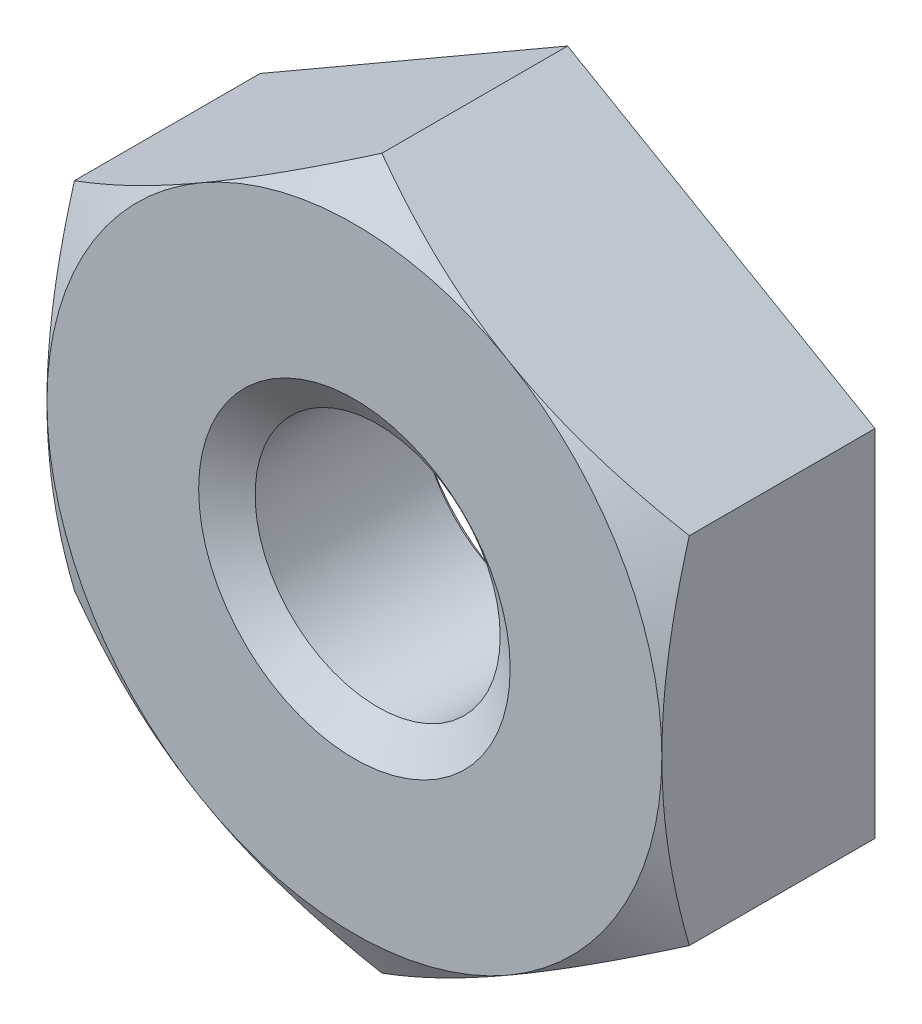
ISO-10303-21;
HEADER;
FILE_DESCRIPTION(('STEP AP214'),'2;1');
FILE_NAME('part.step','',(''),(''),'','','');
FILE_SCHEMA(('AUTOMOTIVE_DESIGN { 1 0 10303 214 1 1 1 1 }'));
ENDSEC;
DATA;
#1=APPLICATION_CONTEXT('core data for automotive mechanical design processes');
#2=APPLICATION_PROTOCOL_DEFINITION('international standard','automotive_design',2000,#1);
#3=PRODUCT_CONTEXT('',#1,'mechanical');
#4=PRODUCT('Part','Part','',(#3));
#5=PRODUCT_RELATED_PRODUCT_CATEGORY('part','',(#4));
#6=PRODUCT_DEFINITION_FORMATION('','',#4);
#7=PRODUCT_DEFINITION_CONTEXT('part definition',#1,'design');
#8=PRODUCT_DEFINITION('design','',#6,#7);
#9=PRODUCT_DEFINITION_SHAPE('','',#8);
#10=(LENGTH_UNIT() NAMED_UNIT(*) SI_UNIT(.MILLI.,.METRE.));
#11=(NAMED_UNIT(*) PLANE_ANGLE_UNIT() SI_UNIT($,.RADIAN.));
#12=(NAMED_UNIT(*) SI_UNIT($,.STERADIAN.) SOLID_ANGLE_UNIT());
#13=UNCERTAINTY_MEASURE_WITH_UNIT(LENGTH_MEASURE(1.E-05),#10,'distance_accuracy_value','');
#14=(GEOMETRIC_REPRESENTATION_CONTEXT(3) GLOBAL_UNCERTAINTY_ASSIGNED_CONTEXT((#13)) GLOBAL_UNIT_ASSIGNED_CONTEXT((#10,
#11,#12)) REPRESENTATION_CONTEXT('',''));
#15=CARTESIAN_POINT('',(0.,0.,0.));
#16=DIRECTION('',(0.,0.,1.));
#17=DIRECTION('',(1.,0.,0.));
#18=AXIS2_PLACEMENT_3D('',#15,#16,#17);
#19=CARTESIAN_POINT('',(0.,0.,-3.302));
#20=DIRECTION('',(0.,0.,1.));
#21=DIRECTION('',(1.,0.,0.));
#22=AXIS2_PLACEMENT_3D('',#19,#20,#21);
#23=CYLINDRICAL_SURFACE('',#22,1.89865);
#24=CARTESIAN_POINT('',(0.,0.,-0.360151747278165));
#25=DIRECTION('',(0.,0.,1.));
#26=DIRECTION('',(1.,0.,0.));
#27=AXIS2_PLACEMENT_3D('',#24,#25,#26);
#28=CIRCLE('',#27,1.89865);
#29=CARTESIAN_POINT('',(1.89865,0.,-0.360151747278165));
#30=VERTEX_POINT('',#29);
#31=EDGE_CURVE('E132',#30,#30,#28,.F.);
#32=CARTESIAN_POINT('',(0.,0.,-2.91644825272184));
#33=DIRECTION('',(0.,0.,-1.));
#34=DIRECTION('',(-1.,0.,0.));
#35=AXIS2_PLACEMENT_3D('',#32,#33,#34);
#36=CIRCLE('',#35,1.89865);
#37=CARTESIAN_POINT('',(1.89865,0.,-2.91644825272184));
#38=VERTEX_POINT('',#37);
#39=EDGE_CURVE('E38',#38,#38,#36,.F.);
#40=CARTESIAN_POINT('',(1.89865,0.,-0.360151747278165));
#41=CARTESIAN_POINT('',(1.89865,0.,-0.386779835876537));
#42=CARTESIAN_POINT('',(1.89865,0.,-0.413407924474908));
#43=CARTESIAN_POINT('',(1.89865,0.,-0.466664101671651));
#44=CARTESIAN_POINT('',(1.89865,0.,-0.493292190270023));
#45=CARTESIAN_POINT('',(1.89865,0.,-0.546548367466766));
#46=CARTESIAN_POINT('',(1.89865,0.,-0.573176456065138));
#47=CARTESIAN_POINT('',(1.89865,0.,-0.626432633261881));
#48=CARTESIAN_POINT('',(1.89865,0.,-0.653060721860253));
#49=CARTESIAN_POINT('',(1.89865,0.,-0.706316899056996));
#50=CARTESIAN_POINT('',(1.89865,0.,-0.732944987655367));
#51=CARTESIAN_POINT('',(1.89865,0.,-0.78620116485211));
#52=CARTESIAN_POINT('',(1.89865,0.,-0.812829253450482));
#53=CARTESIAN_POINT('',(1.89865,0.,-0.866085430647225));
#54=CARTESIAN_POINT('',(1.89865,0.,-0.892713519245596));
#55=CARTESIAN_POINT('',(1.89865,0.,-0.94596969644234));
#56=CARTESIAN_POINT('',(1.89865,0.,-0.972597785040711));
#57=CARTESIAN_POINT('',(1.89865,0.,-1.02585396223745));
#58=CARTESIAN_POINT('',(1.89865,0.,-1.05248205083583));
#59=CARTESIAN_POINT('',(1.89865,0.,-1.10573822803257));
#60=CARTESIAN_POINT('',(1.89865,0.,-1.13236631663094));
#61=CARTESIAN_POINT('',(1.89865,0.,-1.18562249382768));
#62=CARTESIAN_POINT('',(1.89865,0.,-1.21225058242606));
#63=CARTESIAN_POINT('',(1.89865,0.,-1.2655067596228));
#64=CARTESIAN_POINT('',(1.89865,0.,-1.29213484822117));
#65=CARTESIAN_POINT('',(1.89865,0.,-1.34539102541791));
#66=CARTESIAN_POINT('',(1.89865,0.,-1.37201911401628));
#67=CARTESIAN_POINT('',(1.89865,0.,-1.42527529121303));
#68=CARTESIAN_POINT('',(1.89865,0.,-1.4519033798114));
#69=CARTESIAN_POINT('',(1.89865,0.,-1.50515955700814));
#70=CARTESIAN_POINT('',(1.89865,0.,-1.53178764560651));
#71=CARTESIAN_POINT('',(1.89865,0.,-1.58504382280326));
#72=CARTESIAN_POINT('',(1.89865,0.,-1.61167191140163));
#73=CARTESIAN_POINT('',(1.89865,0.,-1.66492808859837));
#74=CARTESIAN_POINT('',(1.89865,0.,-1.69155617719674));
#75=CARTESIAN_POINT('',(1.89865,0.,-1.74481235439349));
#76=CARTESIAN_POINT('',(1.89865,0.,-1.77144044299186));
#77=CARTESIAN_POINT('',(1.89865,0.,-1.8246966201886));
#78=CARTESIAN_POINT('',(1.89865,0.,-1.85132470878697));
#79=CARTESIAN_POINT('',(1.89865,0.,-1.90458088598372));
#80=CARTESIAN_POINT('',(1.89865,0.,-1.93120897458209));
#81=CARTESIAN_POINT('',(1.89865,0.,-1.98446515177883));
#82=CARTESIAN_POINT('',(1.89865,0.,-2.0110932403772));
#83=CARTESIAN_POINT('',(1.89865,0.,-2.06434941757395));
#84=CARTESIAN_POINT('',(1.89865,0.,-2.09097750617232));
#85=CARTESIAN_POINT('',(1.89865,0.,-2.14423368336906));
#86=CARTESIAN_POINT('',(1.89865,0.,-2.17086177196743));
#87=CARTESIAN_POINT('',(1.89865,0.,-2.22411794916417));
#88=CARTESIAN_POINT('',(1.89865,0.,-2.25074603776255));
#89=CARTESIAN_POINT('',(1.89865,0.,-2.30400221495929));
#90=CARTESIAN_POINT('',(1.89865,0.,-2.33063030355766));
#91=CARTESIAN_POINT('',(1.89865,0.,-2.3838864807544));
#92=CARTESIAN_POINT('',(1.89865,0.,-2.41051456935278));
#93=CARTESIAN_POINT('',(1.89865,0.,-2.46377074654952));
#94=CARTESIAN_POINT('',(1.89865,0.,-2.49039883514789));
#95=CARTESIAN_POINT('',(1.89865,0.,-2.54365501234463));
#96=CARTESIAN_POINT('',(1.89865,0.,-2.570283100943));
#97=CARTESIAN_POINT('',(1.89865,0.,-2.62353927813975));
#98=CARTESIAN_POINT('',(1.89865,0.,-2.65016736673812));
#99=CARTESIAN_POINT('',(1.89865,0.,-2.70342354393486));
#100=CARTESIAN_POINT('',(1.89865,0.,-2.73005163253323));
#101=CARTESIAN_POINT('',(1.89865,0.,-2.78330780972998));
#102=CARTESIAN_POINT('',(1.89865,0.,-2.80993589832835));
#103=CARTESIAN_POINT('',(1.89865,0.,-2.86319207552509));
#104=CARTESIAN_POINT('',(1.89865,0.,-2.88982016412346));
#105=CARTESIAN_POINT('',(1.89865,0.,-2.91644825272184));
#106=B_SPLINE_CURVE_WITH_KNOTS('',3,(#40,#41,#42,#43,#44,#45,#46,#47,#48,#49,#50,#51,#52,#53,
#54,#55,#56,#57,#58,#59,#60,#61,#62,#63,#64,#65,#66,#67,#68,#69,#70,#71,#72,#73,#74,#75,#76,#77,
#78,#79,#80,#81,#82,#83,#84,#85,#86,#87,#88,#89,#90,#91,#92,#93,#94,#95,#96,#97,#98,#99,#100,
#101,#102,#103,#104,#105),.UNSPECIFIED.,.F.,.F.,(4,2,2,2,2,2,2,2,2,2,2,2,2,2,2,2,2,2,2,2,2,2,2,
2,2,2,2,2,2,2,2,2,4),(0.,0.0798842657951148,0.15976853159023,0.239652797385344,
0.319537063180459,0.399421328975573,0.479305594770688,0.559189860565803,0.639074126360918,
0.718958392156033,0.798842657951147,0.878726923746262,0.958611189541376,1.03849545533649,
1.11837972113161,1.19826398692672,1.27814825272184,1.35803251851695,1.43791678431206,
1.51780105010718,1.59768531590229,1.67756958169741,1.75745384749252,1.83733811328764,
1.91722237908275,1.99710664487787,2.07699091067298,2.1568751764681,2.23675944226321,
2.31664370805833,2.39652797385344,2.47641223964856,2.55629650544367),.UNSPECIFIED.);
#107=EDGE_CURVE('BSEAM33',#30,#38,#106,.T.);
#108=ORIENTED_EDGE('',*,*,#31,.F.);
#109=ORIENTED_EDGE('',*,*,#39,.F.);
#110=ORIENTED_EDGE('',*,*,#107,.T.);
#111=ORIENTED_EDGE('',*,*,#107,.F.);
#112=EDGE_LOOP('',(#108,#110,#109,#111));
#113=FACE_BOUND('',#112,.T.);
#114=ADVANCED_FACE('F33',(#113),#23,.F.);
#115=CARTESIAN_POINT('',(0.,5.49926131403119,-3.302));
#116=DIRECTION('',(0.,0.,-1.));
#117=DIRECTION('',(-1.,0.,0.));
#118=AXIS2_PLACEMENT_3D('',#115,#116,#117);
#119=PLANE('',#118);
#120=DIRECTION('',(-0.866025403784437,-0.500000000000002,0.));
#121=VECTOR('',#120,1.);
#122=CARTESIAN_POINT('',(0.,5.49926131403119,-3.302));
#123=LINE('',#122,#121);
#124=CARTESIAN_POINT('',(0.,5.49926131403119,-3.302));
#125=VERTEX_POINT('',#124);
#126=CARTESIAN_POINT('',(-4.7625,2.74963065701559,-3.302));
#127=VERTEX_POINT('',#126);
#128=EDGE_CURVE('E259',#125,#127,#123,.T.);
#129=ORIENTED_EDGE('',*,*,#128,.F.);
#130=DIRECTION('',(-0.866025403784438,0.500000000000001,0.));
#131=VECTOR('',#130,1.);
#132=CARTESIAN_POINT('',(4.7625,2.74963065701559,-3.302));
#133=LINE('',#132,#131);
#134=CARTESIAN_POINT('',(4.7625,2.74963065701559,-3.302));
#135=VERTEX_POINT('',#134);
#136=EDGE_CURVE('E236',#135,#125,#133,.T.);
#137=ORIENTED_EDGE('',*,*,#136,.F.);
#138=DIRECTION('',(0.,-1.,0.));
#139=VECTOR('',#138,1.);
#140=CARTESIAN_POINT('',(4.7625,2.74963065701559,-3.302));
#141=LINE('',#140,#139);
#142=CARTESIAN_POINT('',(4.7625,-2.7496306570156,-3.302));
#143=VERTEX_POINT('',#142);
#144=EDGE_CURVE('E248',#135,#143,#141,.T.);
#145=ORIENTED_EDGE('',*,*,#144,.T.);
#146=DIRECTION('',(0.866025403784438,0.500000000000002,0.));
#147=VECTOR('',#146,1.);
#148=CARTESIAN_POINT('',(0.,-5.49926131403121,-3.302));
#149=LINE('',#148,#147);
#150=CARTESIAN_POINT('',(0.,-5.49926131403121,-3.302));
#151=VERTEX_POINT('',#150);
#152=EDGE_CURVE('E250',#151,#143,#149,.T.);
#153=ORIENTED_EDGE('',*,*,#152,.F.);
#154=DIRECTION('',(0.866025403784438,-0.500000000000001,0.));
#155=VECTOR('',#154,1.);
#156=CARTESIAN_POINT('',(-4.7625,-2.7496306570156,-3.302));
#157=LINE('',#156,#155);
#158=CARTESIAN_POINT('',(-4.7625,-2.7496306570156,-3.302));
#159=VERTEX_POINT('',#158);
#160=EDGE_CURVE('E253',#159,#151,#157,.T.);
#161=ORIENTED_EDGE('',*,*,#160,.F.);
#162=DIRECTION('',(0.,-1.,0.));
#163=VECTOR('',#162,1.);
#164=CARTESIAN_POINT('',(-4.7625,2.74963065701559,-3.302));
#165=LINE('',#164,#163);
#166=EDGE_CURVE('E256',#127,#159,#165,.T.);
#167=ORIENTED_EDGE('',*,*,#166,.F.);
#168=EDGE_LOOP('',(#129,#137,#145,#153,#161,#167));
#169=FACE_BOUND('',#168,.T.);
#170=CARTESIAN_POINT('',(0.,0.,-3.302));
#171=DIRECTION('',(0.,0.,-1.));
#172=DIRECTION('',(-1.,0.,0.));
#173=AXIS2_PLACEMENT_3D('',#170,#171,#172);
#174=CIRCLE('',#173,2.413);
#175=CARTESIAN_POINT('',(-2.413,0.,-3.302));
#176=VERTEX_POINT('',#175);
#177=EDGE_CURVE('E220',#176,#176,#174,.F.);
#178=ORIENTED_EDGE('',*,*,#177,.T.);
#179=EDGE_LOOP('',(#178));
#180=FACE_BOUND('',#179,.T.);
#181=ADVANCED_FACE('F207',(#169,#180),#119,.T.);
#182=CARTESIAN_POINT('',(0.,5.49926131403119,0.));
#183=DIRECTION('',(0.,0.,-1.));
#184=DIRECTION('',(-1.,0.,0.));
#185=AXIS2_PLACEMENT_3D('',#182,#183,#184);
#186=PLANE('',#185);
#187=CARTESIAN_POINT('',(0.,0.,0.));
#188=DIRECTION('',(0.,0.,-1.));
#189=DIRECTION('',(-1.,0.,0.));
#190=AXIS2_PLACEMENT_3D('',#187,#188,#189);
#191=CIRCLE('',#190,4.7625);
#192=CARTESIAN_POINT('',(-2.38125000000001,4.12444598552338,0.));
#193=VERTEX_POINT('',#192);
#194=CARTESIAN_POINT('',(-4.7625,0.,0.));
#195=VERTEX_POINT('',#194);
#196=EDGE_CURVE('E45',#193,#195,#191,.F.);
#197=ORIENTED_EDGE('',*,*,#196,.T.);
#198=CARTESIAN_POINT('',(-2.38125000000001,-4.12444598552339,0.));
#199=VERTEX_POINT('',#198);
#200=EDGE_CURVE('E11',#195,#199,#191,.F.);
#201=ORIENTED_EDGE('',*,*,#200,.T.);
#202=CARTESIAN_POINT('',(2.38125000000001,-4.12444598552338,0.));
#203=VERTEX_POINT('',#202);
#204=EDGE_CURVE('E43',#199,#203,#191,.F.);
#205=ORIENTED_EDGE('',*,*,#204,.T.);
#206=CARTESIAN_POINT('',(4.7625,0.,0.));
#207=VERTEX_POINT('',#206);
#208=EDGE_CURVE('E111',#203,#207,#191,.F.);
#209=ORIENTED_EDGE('',*,*,#208,.T.);
#210=CARTESIAN_POINT('',(0.,0.,0.));
#211=DIRECTION('',(0.,0.,1.));
#212=DIRECTION('',(1.,0.,0.));
#213=AXIS2_PLACEMENT_3D('',#210,#211,#212);
#214=CIRCLE('',#213,4.7625);
#215=CARTESIAN_POINT('',(2.38125000000001,4.12444598552339,0.));
#216=VERTEX_POINT('',#215);
#217=EDGE_CURVE('E123',#207,#216,#214,.T.);
#218=ORIENTED_EDGE('',*,*,#217,.T.);
#219=EDGE_CURVE('E138',#216,#193,#191,.F.);
#220=ORIENTED_EDGE('',*,*,#219,.T.);
#221=EDGE_LOOP('',(#197,#201,#205,#209,#218,#220));
#222=FACE_BOUND('',#221,.T.);
#223=CARTESIAN_POINT('',(0.,0.,0.));
#224=DIRECTION('',(0.,0.,1.));
#225=DIRECTION('',(1.,0.,0.));
#226=AXIS2_PLACEMENT_3D('',#223,#224,#225);
#227=CIRCLE('',#226,2.413);
#228=CARTESIAN_POINT('',(2.413,0.,0.));
#229=VERTEX_POINT('',#228);
#230=EDGE_CURVE('E219',#229,#229,#227,.T.);
#231=ORIENTED_EDGE('',*,*,#230,.F.);
#232=EDGE_LOOP('',(#231));
#233=FACE_BOUND('',#232,.T.);
#234=ADVANCED_FACE('F135',(#222,#233),#186,.F.);
#235=CARTESIAN_POINT('',(0.,5.49926131403119,-3.302));
#236=DIRECTION('',(-0.500000000000002,0.866025403784437,0.));
#237=DIRECTION('',(-0.866025403784438,-0.500000000000002,0.));
#238=AXIS2_PLACEMENT_3D('',#235,#236,#237);
#239=PLANE('',#238);
#240=DIRECTION('',(0.,0.,1.));
#241=VECTOR('',#240,1.);
#242=CARTESIAN_POINT('',(-4.7625,2.74963065701559,-3.302));
#243=LINE('',#242,#241);
#244=CARTESIAN_POINT('',(-4.7625,2.74963065701559,-0.425369342984413));
#245=VERTEX_POINT('',#244);
#246=EDGE_CURVE('E232',#127,#245,#243,.T.);
#247=ORIENTED_EDGE('',*,*,#246,.T.);
#248=CARTESIAN_POINT('',(-4.7627,2.74951518696175,-0.425436011750766));
#249=CARTESIAN_POINT('',(-4.55340263838612,2.8703530750302,-0.355653612413944));
#250=CARTESIAN_POINT('',(-4.34231515161877,2.99222449233789,-0.292183264615223));
#251=CARTESIAN_POINT('',(-3.91648500907589,3.23807763976408,-0.181395196068723));
#252=CARTESIAN_POINT('',(-3.701734787416,3.36206373804795,-0.134116665429796));
#253=CARTESIAN_POINT('',(-3.27486304406647,3.60851825398025,-0.0605335253687847));
#254=CARTESIAN_POINT('',(-3.06280800150459,3.73094828988637,-0.0337387922017269));
#255=CARTESIAN_POINT('',(-2.7439794939507,3.91502401454793,-0.00971112218087719));
#256=CARTESIAN_POINT('',(-2.63763059112772,3.9764245822208,-0.00439464100931425));
#257=CARTESIAN_POINT('',(-2.42483449751003,4.09928246415348,0.00075983656829377));
#258=CARTESIAN_POINT('',(-2.31838730985274,4.16073977660189,0.00059800219079271));
#259=CARTESIAN_POINT('',(-2.02675051194544,4.32911636037927,-0.00738494982191055));
#260=CARTESIAN_POINT('',(-1.84165753319303,4.43597984148709,-0.0207924204878947));
#261=CARTESIAN_POINT('',(-1.47270002105863,4.64899756043742,-0.0633078628436934));
#262=CARTESIAN_POINT('',(-1.28883678458933,4.75515104950705,-0.0924303682801027));
#263=CARTESIAN_POINT('',(-0.919135889202234,4.96859796097843,-0.165229253586903));
#264=CARTESIAN_POINT('',(-0.733344890273214,5.07586444422311,-0.209214113046657));
#265=CARTESIAN_POINT('',(-0.36453373099168,5.28879766631445,-0.309042279938831));
#266=CARTESIAN_POINT('',(-0.181508846544094,5.39446713261866,-0.364862134678061));
#267=CARTESIAN_POINT('',(0.000199999999997476,5.49937678408503,-0.425436011750772));
#268=B_SPLINE_CURVE_WITH_KNOTS('',3,(#248,#249,#250,#251,#252,#253,#254,#255,#256,#257,#258,
#259,#260,#261,#262,#263,#264,#265,#266,#267),.UNSPECIFIED.,.F.,.F.,(4,2,2,2,2,2,2,2,2,4),(0.,
0.754910190012917,1.51163483480638,2.24963134670895,2.61827336240839,2.9869039913527,
3.6286742319225,4.27103902109237,4.92765153591997,5.58297484368456),.UNSPECIFIED.);
#269=EDGE_CURVE('E57',#245,#193,#268,.T.);
#270=ORIENTED_EDGE('',*,*,#269,.T.);
#271=CARTESIAN_POINT('',(0.,5.49926131403119,-0.425369342984412));
#272=VERTEX_POINT('',#271);
#273=EDGE_CURVE('E146',#193,#272,#268,.T.);
#274=ORIENTED_EDGE('',*,*,#273,.T.);
#275=DIRECTION('',(0.,0.,1.));
#276=VECTOR('',#275,1.);
#277=CARTESIAN_POINT('',(0.,5.49926131403119,-3.302));
#278=LINE('',#277,#276);
#279=EDGE_CURVE('E231',#125,#272,#278,.T.);
#280=ORIENTED_EDGE('',*,*,#279,.F.);
#281=ORIENTED_EDGE('',*,*,#128,.T.);
#282=EDGE_LOOP('',(#247,#270,#274,#280,#281));
#283=FACE_BOUND('',#282,.T.);
#284=ADVANCED_FACE('F35',(#283),#239,.T.);
#285=CARTESIAN_POINT('',(4.7625,2.74963065701559,-3.302));
#286=DIRECTION('',(0.500000000000001,0.866025403784438,0.));
#287=DIRECTION('',(-0.866025403784438,0.500000000000001,0.));
#288=AXIS2_PLACEMENT_3D('',#285,#286,#287);
#289=PLANE('',#288);
#290=ORIENTED_EDGE('',*,*,#279,.T.);
#291=CARTESIAN_POINT('',(-0.000200000000002983,5.49937678408503,-0.425436011750773));
#292=CARTESIAN_POINT('',(0.209097361613875,5.37853889601658,-0.35565361241395));
#293=CARTESIAN_POINT('',(0.420184848381226,5.25666747870889,-0.292183264615228));
#294=CARTESIAN_POINT('',(0.846014990924112,5.01081433128269,-0.181395196068727));
#295=CARTESIAN_POINT('',(1.060765212584,4.88682823299882,-0.134116665429799));
#296=CARTESIAN_POINT('',(1.48763695593353,4.64037371706653,-0.0605335253687874));
#297=CARTESIAN_POINT('',(1.69969199849541,4.51794368116041,-0.033738792201729));
#298=CARTESIAN_POINT('',(2.0185205060493,4.33386795649885,-0.00971112218087835));
#299=CARTESIAN_POINT('',(2.12486940887228,4.27246738882597,-0.00439464100931504));
#300=CARTESIAN_POINT('',(2.33766550248998,4.1496095068933,0.00075983656829355));
#301=CARTESIAN_POINT('',(2.44411269014726,4.08815219444488,0.000598002190792708));
#302=CARTESIAN_POINT('',(2.73574948805456,3.9197756106675,-0.00738494982190985));
#303=CARTESIAN_POINT('',(2.92084246680697,3.81291212955969,-0.0207924204878934));
#304=CARTESIAN_POINT('',(3.28979997894137,3.59989441060936,-0.0633078628436912));
#305=CARTESIAN_POINT('',(3.47366321541067,3.49374092153973,-0.0924303682801003));
#306=CARTESIAN_POINT('',(3.84336411079777,3.28029401006835,-0.165229253586899));
#307=CARTESIAN_POINT('',(4.02915510972679,3.17302752682367,-0.209214113046653));
#308=CARTESIAN_POINT('',(4.39796626900832,2.96009430473233,-0.309042279938826));
#309=CARTESIAN_POINT('',(4.58099115345591,2.85442483842812,-0.364862134678056));
#310=CARTESIAN_POINT('',(4.7627,2.74951518696175,-0.425436011750767));
#311=B_SPLINE_CURVE_WITH_KNOTS('',3,(#291,#292,#293,#294,#295,#296,#297,#298,#299,#300,#301,
#302,#303,#304,#305,#306,#307,#308,#309,#310),.UNSPECIFIED.,.F.,.F.,(4,2,2,2,2,2,2,2,2,4),(0.,
0.754910190012919,1.51163483480638,2.24963134670895,2.6182733624084,2.9869039913527,
3.6286742319225,4.27103902109237,4.92765153591997,5.58297484368456),.UNSPECIFIED.);
#312=EDGE_CURVE('E143',#272,#216,#311,.T.);
#313=ORIENTED_EDGE('',*,*,#312,.T.);
#314=CARTESIAN_POINT('',(4.7625,2.74963065701561,-0.425369342984412));
#315=VERTEX_POINT('',#314);
#316=EDGE_CURVE('E126',#216,#315,#311,.T.);
#317=ORIENTED_EDGE('',*,*,#316,.T.);
#318=DIRECTION('',(0.,0.,1.));
#319=VECTOR('',#318,1.);
#320=CARTESIAN_POINT('',(4.7625,2.74963065701559,-3.302));
#321=LINE('',#320,#319);
#322=EDGE_CURVE('E142',#135,#315,#321,.T.);
#323=ORIENTED_EDGE('',*,*,#322,.F.);
#324=ORIENTED_EDGE('',*,*,#136,.T.);
#325=EDGE_LOOP('',(#290,#313,#317,#323,#324));
#326=FACE_BOUND('',#325,.T.);
#327=ADVANCED_FACE('F264',(#326),#289,.T.);
#328=CARTESIAN_POINT('',(4.7625,2.74963065701559,-3.302));
#329=DIRECTION('',(-1.,0.,0.));
#330=DIRECTION('',(0.,0.,1.));
#331=AXIS2_PLACEMENT_3D('',#328,#329,#330);
#332=PLANE('',#331);
#333=CARTESIAN_POINT('',(4.7625,-7.29242571304484,-2.27898343403964));
#334=CARTESIAN_POINT('',(4.7625,-7.08332503258644,-2.17793443460892));
#335=CARTESIAN_POINT('',(4.7625,-6.87372996761939,-2.07788994627172));
#336=CARTESIAN_POINT('',(4.7625,-6.45328375890255,-1.88038400304187));
#337=CARTESIAN_POINT('',(4.7625,-6.24243240531598,-1.78292299537275));
#338=CARTESIAN_POINT('',(4.7625,-5.818067307616,-1.59064459480452));
#339=CARTESIAN_POINT('',(4.7625,-5.60454523269944,-1.49584552190854));
#340=CARTESIAN_POINT('',(4.7625,-5.17574610716181,-1.31031922922938));
#341=CARTESIAN_POINT('',(4.7625,-4.96046914871243,-1.21959179719919));
#342=CARTESIAN_POINT('',(4.7625,-4.52514542755381,-1.04221436450315));
#343=CARTESIAN_POINT('',(4.7625,-4.30507255346547,-0.95562809667714));
#344=CARTESIAN_POINT('',(4.7625,-3.86233085885286,-0.789237026079924));
#345=CARTESIAN_POINT('',(4.7625,-3.63966175263651,-0.709432977795153));
#346=CARTESIAN_POINT('',(4.7625,-3.19183146915337,-0.558750437330524));
#347=CARTESIAN_POINT('',(4.7625,-2.96667674136296,-0.48785296946411));
#348=CARTESIAN_POINT('',(4.7625,-2.51316408606384,-0.357286935151367));
#349=CARTESIAN_POINT('',(4.7625,-2.28480719615869,-0.297614817726105));
#350=CARTESIAN_POINT('',(4.7625,-1.82474524250016,-0.192393335725107));
#351=CARTESIAN_POINT('',(4.7625,-1.59303930440612,-0.146847731515044));
#352=CARTESIAN_POINT('',(4.7625,-1.12680140245446,-0.0729572667243252));
#353=CARTESIAN_POINT('',(4.7625,-0.892269436098454,-0.0446124213513015));
#354=CARTESIAN_POINT('',(4.7625,-0.540098243423066,-0.0168127698224287));
#355=CARTESIAN_POINT('',(4.7625,-0.423010288487483,-0.00999774479560525));
#356=CARTESIAN_POINT('',(4.7625,-0.188645495023611,-0.00132916739532927));
#357=CARTESIAN_POINT('',(4.7625,-0.0713686589680039,0.000524449409053196));
#358=CARTESIAN_POINT('',(4.7625,0.163123105354883,-0.000779595326748919));
#359=CARTESIAN_POINT('',(4.7625,0.28033804175227,-0.0039358420021622));
#360=CARTESIAN_POINT('',(4.7625,0.514533140154528,-0.015179573740842));
#361=CARTESIAN_POINT('',(4.7625,0.631513289308019,-0.023267321728025));
#362=CARTESIAN_POINT('',(4.7625,0.915050030184746,-0.0486788919016478));
#363=CARTESIAN_POINT('',(4.7625,1.08138937418057,-0.0684745311551028));
#364=CARTESIAN_POINT('',(4.7625,1.41276151801411,-0.116933997609659));
#365=CARTESIAN_POINT('',(4.7625,1.57779414061616,-0.145599007360522));
#366=CARTESIAN_POINT('',(4.7625,2.07083902042288,-0.243383100627565));
#367=CARTESIAN_POINT('',(4.7625,2.39654516294854,-0.324265654459844));
#368=CARTESIAN_POINT('',(4.7625,2.8839114252215,-0.46376778130389));
#369=CARTESIAN_POINT('',(4.7625,3.04811363656014,-0.514009375908405));
#370=CARTESIAN_POINT('',(4.7625,3.37480455011007,-0.61946386437005));
#371=CARTESIAN_POINT('',(4.7625,3.53729434901435,-0.67467332935653));
#372=CARTESIAN_POINT('',(4.7625,3.85988055284393,-0.788914900372854));
#373=CARTESIAN_POINT('',(4.7625,4.01998528140538,-0.847923740867384));
#374=CARTESIAN_POINT('',(4.7625,4.3389525397456,-0.969404920092008));
#375=CARTESIAN_POINT('',(4.7625,4.4978145374447,-1.03187865865025));
#376=CARTESIAN_POINT('',(4.7625,4.6561021660602,-1.09574291091382));
#377=B_SPLINE_CURVE_WITH_KNOTS('',3,(#333,#334,#335,#336,#337,#338,#339,#340,#341,#342,#343,
#344,#345,#346,#347,#348,#349,#350,#351,#352,#353,#354,#355,#356,#357,#358,#359,#360,#361,#362,
#363,#364,#365,#366,#367,#368,#369,#370,#371,#372,#373,#374,#375,#376),.UNSPECIFIED.,.F.,.F.,(4,
2,2,2,2,2,2,2,2,2,2,2,2,2,2,2,2,2,2,2,2,4),(0.,0.696720165483735,1.39356016205725,
2.09438789250382,2.79517904757872,3.50457374312629,4.21404725210227,4.92198260780581,
5.6296936403172,6.33759289852653,7.04549278260686,7.39726182154395,7.74902629223847,
8.10069143675107,8.45237533199633,8.95462912158064,9.45694990534677,10.4623513294482,
10.9774608355396,11.4922174961111,12.0040767603637,12.5161443452105),.UNSPECIFIED.);
#378=CARTESIAN_POINT('',(4.76250000000001,-2.7496306570156,-0.425369342984412));
#379=VERTEX_POINT('',#378);
#380=EDGE_CURVE('E107',#379,#207,#377,.T.);
#381=ORIENTED_EDGE('',*,*,#380,.F.);
#382=DIRECTION('',(0.,0.,1.));
#383=VECTOR('',#382,1.);
#384=CARTESIAN_POINT('',(4.7625,-2.7496306570156,-3.302));
#385=LINE('',#384,#383);
#386=EDGE_CURVE('E241',#143,#379,#385,.T.);
#387=ORIENTED_EDGE('',*,*,#386,.F.);
#388=ORIENTED_EDGE('',*,*,#144,.F.);
#389=ORIENTED_EDGE('',*,*,#322,.T.);
#390=EDGE_CURVE('E120',#207,#315,#377,.T.);
#391=ORIENTED_EDGE('',*,*,#390,.F.);
#392=EDGE_LOOP('',(#381,#387,#388,#389,#391));
#393=FACE_BOUND('',#392,.T.);
#394=ADVANCED_FACE('F140',(#393),#332,.F.);
#395=CARTESIAN_POINT('',(0.,-5.49926131403121,-3.302));
#396=DIRECTION('',(0.500000000000002,-0.866025403784438,0.));
#397=DIRECTION('',(0.866025403784438,0.500000000000002,0.));
#398=AXIS2_PLACEMENT_3D('',#395,#396,#397);
#399=PLANE('',#398);
#400=ORIENTED_EDGE('',*,*,#386,.T.);
#401=CARTESIAN_POINT('',(4.7627,-2.74951518696176,-0.42543601175077));
#402=CARTESIAN_POINT('',(4.55340263838612,-2.87035307503021,-0.355653612413947));
#403=CARTESIAN_POINT('',(4.34231515161877,-2.99222449233791,-0.292183264615227));
#404=CARTESIAN_POINT('',(3.91648500907588,-3.2380776397641,-0.181395196068728));
#405=CARTESIAN_POINT('',(3.70173478741599,-3.36206373804797,-0.134116665429801));
#406=CARTESIAN_POINT('',(3.27486304406647,-3.60851825398026,-0.0605335253687905));
#407=CARTESIAN_POINT('',(3.06280800150458,-3.73094828988639,-0.0337387922017328));
#408=CARTESIAN_POINT('',(2.7439794939507,-3.91502401454795,-0.00971112218088342));
#409=CARTESIAN_POINT('',(2.63763059112771,-3.97642458222082,-0.00439464100932059));
#410=CARTESIAN_POINT('',(2.42483449751002,-4.0992824641535,0.000759836568287083));
#411=CARTESIAN_POINT('',(2.31838730985274,-4.16073977660191,0.000598002190785806));
#412=CARTESIAN_POINT('',(2.02675051194544,-4.32911636037929,-0.00738494982191807));
#413=CARTESIAN_POINT('',(1.84165753319303,-4.4359798414871,-0.0207924204879026));
#414=CARTESIAN_POINT('',(1.47270002105863,-4.64899756043744,-0.0633078628437016));
#415=CARTESIAN_POINT('',(1.28883678458933,-4.75515104950706,-0.092430368280111));
#416=CARTESIAN_POINT('',(0.919135889202231,-4.96859796097845,-0.165229253586911));
#417=CARTESIAN_POINT('',(0.733344890273211,-5.07586444422313,-0.209214113046665));
#418=CARTESIAN_POINT('',(0.364533730991678,-5.28879766631446,-0.309042279938839));
#419=CARTESIAN_POINT('',(0.181508846544091,-5.39446713261868,-0.364862134678069));
#420=CARTESIAN_POINT('',(-0.000199999999999733,-5.49937678408504,-0.42543601175078));
#421=B_SPLINE_CURVE_WITH_KNOTS('',3,(#401,#402,#403,#404,#405,#406,#407,#408,#409,#410,#411,
#412,#413,#414,#415,#416,#417,#418,#419,#420),.UNSPECIFIED.,.F.,.F.,(4,2,2,2,2,2,2,2,2,4),(0.,
0.754910190012919,1.51163483480638,2.24963134670895,2.61827336240839,2.9869039913527,
3.6286742319225,4.27103902109237,4.92765153591997,5.58297484368456),.UNSPECIFIED.);
#422=EDGE_CURVE('E114',#379,#203,#421,.T.);
#423=ORIENTED_EDGE('',*,*,#422,.T.);
#424=CARTESIAN_POINT('',(0.,-5.49926131403119,-0.425369342984412));
#425=VERTEX_POINT('',#424);
#426=EDGE_CURVE('E153',#203,#425,#421,.T.);
#427=ORIENTED_EDGE('',*,*,#426,.T.);
#428=DIRECTION('',(0.,0.,1.));
#429=VECTOR('',#428,1.);
#430=CARTESIAN_POINT('',(0.,-5.49926131403121,-3.302));
#431=LINE('',#430,#429);
#432=EDGE_CURVE('E238',#151,#425,#431,.T.);
#433=ORIENTED_EDGE('',*,*,#432,.F.);
#434=ORIENTED_EDGE('',*,*,#152,.T.);
#435=EDGE_LOOP('',(#400,#423,#427,#433,#434));
#436=FACE_BOUND('',#435,.T.);
#437=ADVANCED_FACE('F195',(#436),#399,.T.);
#438=CARTESIAN_POINT('',(-4.7625,-2.7496306570156,-3.302));
#439=DIRECTION('',(-0.500000000000001,-0.866025403784438,0.));
#440=DIRECTION('',(0.866025403784438,-0.500000000000001,0.));
#441=AXIS2_PLACEMENT_3D('',#438,#439,#440);
#442=PLANE('',#441);
#443=ORIENTED_EDGE('',*,*,#432,.T.);
#444=CARTESIAN_POINT('',(0.000200000000000385,-5.49937678408504,-0.42543601175078));
#445=CARTESIAN_POINT('',(-0.209097361613879,-5.37853889601659,-0.355653612413958));
#446=CARTESIAN_POINT('',(-0.42018484838123,-5.2566674787089,-0.292183264615236));
#447=CARTESIAN_POINT('',(-0.846014990924117,-5.01081433128271,-0.181395196068735));
#448=CARTESIAN_POINT('',(-1.06076521258401,-4.88682823299884,-0.134116665429807));
#449=CARTESIAN_POINT('',(-1.48763695593353,-4.64037371706654,-0.0605335253687949));
#450=CARTESIAN_POINT('',(-1.69969199849542,-4.51794368116042,-0.033738792201737));
#451=CARTESIAN_POINT('',(-2.01852050604931,-4.33386795649886,-0.0097111221808862));
#452=CARTESIAN_POINT('',(-2.12486940887229,-4.27246738882598,-0.00439464100932271));
#453=CARTESIAN_POINT('',(-2.33766550248999,-4.14960950689331,0.000759836568285939));
#454=CARTESIAN_POINT('',(-2.44411269014727,-4.08815219444489,0.000598002190784974));
#455=CARTESIAN_POINT('',(-2.73574948805457,-3.91977561066752,-0.00738494982191797));
#456=CARTESIAN_POINT('',(-2.92084246680698,-3.8129121295597,-0.0207924204879018));
#457=CARTESIAN_POINT('',(-3.28979997894138,-3.59989441060937,-0.0633078628436994));
#458=CARTESIAN_POINT('',(-3.47366321541067,-3.49374092153975,-0.0924303682801082));
#459=CARTESIAN_POINT('',(-3.84336411079777,-3.28029401006836,-0.165229253586907));
#460=CARTESIAN_POINT('',(-4.02915510972679,-3.17302752682368,-0.20921411304666));
#461=CARTESIAN_POINT('',(-4.39796626900832,-2.96009430473235,-0.309042279938832));
#462=CARTESIAN_POINT('',(-4.58099115345591,-2.85442483842813,-0.364862134678062));
#463=CARTESIAN_POINT('',(-4.7627,-2.74951518696177,-0.425436011750772));
#464=B_SPLINE_CURVE_WITH_KNOTS('',3,(#444,#445,#446,#447,#448,#449,#450,#451,#452,#453,#454,
#455,#456,#457,#458,#459,#460,#461,#462,#463),.UNSPECIFIED.,.F.,.F.,(4,2,2,2,2,2,2,2,2,4),(0.,
0.754910190012921,1.51163483480639,2.24963134670896,2.6182733624084,2.98690399135271,
3.62867423192251,4.27103902109237,4.92765153591997,5.58297484368455),.UNSPECIFIED.);
#465=EDGE_CURVE('E189',#425,#199,#464,.T.);
#466=ORIENTED_EDGE('',*,*,#465,.T.);
#467=CARTESIAN_POINT('',(-4.7625,-2.7496306570156,-0.425369342984412));
#468=VERTEX_POINT('',#467);
#469=EDGE_CURVE('E182',#199,#468,#464,.T.);
#470=ORIENTED_EDGE('',*,*,#469,.T.);
#471=DIRECTION('',(0.,0.,1.));
#472=VECTOR('',#471,1.);
#473=CARTESIAN_POINT('',(-4.7625,-2.7496306570156,-3.302));
#474=LINE('',#473,#472);
#475=EDGE_CURVE('E235',#159,#468,#474,.T.);
#476=ORIENTED_EDGE('',*,*,#475,.F.);
#477=ORIENTED_EDGE('',*,*,#160,.T.);
#478=EDGE_LOOP('',(#443,#466,#470,#476,#477));
#479=FACE_BOUND('',#478,.T.);
#480=ADVANCED_FACE('F191',(#479),#442,.T.);
#481=CARTESIAN_POINT('',(-4.7625,2.74963065701559,-3.302));
#482=DIRECTION('',(-1.,0.,0.));
#483=DIRECTION('',(0.,0.,1.));
#484=AXIS2_PLACEMENT_3D('',#481,#482,#483);
#485=PLANE('',#484);
#486=ORIENTED_EDGE('',*,*,#475,.T.);
#487=CARTESIAN_POINT('',(-4.7625,-7.29242571304485,-2.27898343403964));
#488=CARTESIAN_POINT('',(-4.7625,-7.08332503258645,-2.17793443460892));
#489=CARTESIAN_POINT('',(-4.7625,-6.8737299676194,-2.07788994627172));
#490=CARTESIAN_POINT('',(-4.7625,-6.45328375890255,-1.88038400304187));
#491=CARTESIAN_POINT('',(-4.7625,-6.24243240531598,-1.78292299537275));
#492=CARTESIAN_POINT('',(-4.7625,-5.818067307616,-1.59064459480452));
#493=CARTESIAN_POINT('',(-4.7625,-5.60454523269944,-1.49584552190855));
#494=CARTESIAN_POINT('',(-4.7625,-5.17574610716182,-1.31031922922938));
#495=CARTESIAN_POINT('',(-4.7625,-4.96046914871243,-1.21959179719919));
#496=CARTESIAN_POINT('',(-4.7625,-4.52514542755381,-1.04221436450316));
#497=CARTESIAN_POINT('',(-4.7625,-4.30507255346547,-0.955628096677142));
#498=CARTESIAN_POINT('',(-4.7625,-3.86233085885287,-0.789237026079926));
#499=CARTESIAN_POINT('',(-4.7625,-3.63966175263651,-0.709432977795154));
#500=CARTESIAN_POINT('',(-4.7625,-3.19183146915337,-0.558750437330526));
#501=CARTESIAN_POINT('',(-4.7625,-2.96667674136296,-0.487852969464112));
#502=CARTESIAN_POINT('',(-4.7625,-2.51316408606384,-0.357286935151368));
#503=CARTESIAN_POINT('',(-4.7625,-2.28480719615869,-0.297614817726107));
#504=CARTESIAN_POINT('',(-4.7625,-1.82474524250016,-0.192393335725109));
#505=CARTESIAN_POINT('',(-4.7625,-1.59303930440613,-0.146847731515046));
#506=CARTESIAN_POINT('',(-4.7625,-1.12680140245446,-0.0729572667243266));
#507=CARTESIAN_POINT('',(-4.7625,-0.892269436098457,-0.0446124213513025));
#508=CARTESIAN_POINT('',(-4.7625,-0.540098243423069,-0.0168127698224296));
#509=CARTESIAN_POINT('',(-4.7625,-0.423010288487485,-0.00999774479560623));
#510=CARTESIAN_POINT('',(-4.7625,-0.188645495023613,-0.00132916739533029));
#511=CARTESIAN_POINT('',(-4.7625,-0.071368658968006,0.000524449409052188));
#512=CARTESIAN_POINT('',(-4.7625,0.16312310535488,-0.000779595326749913));
#513=CARTESIAN_POINT('',(-4.7625,0.280338041752268,-0.0039358420021632));
#514=CARTESIAN_POINT('',(-4.7625,0.514533140154525,-0.015179573740843));
#515=CARTESIAN_POINT('',(-4.7625,0.631513289308017,-0.023267321728026));
#516=CARTESIAN_POINT('',(-4.7625,0.915050030184744,-0.0486788919016489));
#517=CARTESIAN_POINT('',(-4.7625,1.08138937418056,-0.0684745311551039));
#518=CARTESIAN_POINT('',(-4.7625,1.41276151801411,-0.11693399760966));
#519=CARTESIAN_POINT('',(-4.7625,1.57779414061616,-0.145599007360522));
#520=CARTESIAN_POINT('',(-4.7625,2.07083902042287,-0.243383100627564));
#521=CARTESIAN_POINT('',(-4.7625,2.39654516294853,-0.324265654459844));
#522=CARTESIAN_POINT('',(-4.7625,2.8839114252215,-0.463767781303889));
#523=CARTESIAN_POINT('',(-4.7625,3.04811363656013,-0.514009375908404));
#524=CARTESIAN_POINT('',(-4.7625,3.37480455011006,-0.619463864370049));
#525=CARTESIAN_POINT('',(-4.7625,3.53729434901435,-0.674673329356529));
#526=CARTESIAN_POINT('',(-4.7625,3.85988055284393,-0.788914900372853));
#527=CARTESIAN_POINT('',(-4.7625,4.01998528140537,-0.847923740867384));
#528=CARTESIAN_POINT('',(-4.7625,4.33895253974559,-0.969404920092007));
#529=CARTESIAN_POINT('',(-4.7625,4.4978145374447,-1.03187865865025));
#530=CARTESIAN_POINT('',(-4.7625,4.6561021660602,-1.09574291091382));
#531=B_SPLINE_CURVE_WITH_KNOTS('',3,(#487,#488,#489,#490,#491,#492,#493,#494,#495,#496,#497,
#498,#499,#500,#501,#502,#503,#504,#505,#506,#507,#508,#509,#510,#511,#512,#513,#514,#515,#516,
#517,#518,#519,#520,#521,#522,#523,#524,#525,#526,#527,#528,#529,#530),.UNSPECIFIED.,.F.,.F.,(4,
2,2,2,2,2,2,2,2,2,2,2,2,2,2,2,2,2,2,2,2,4),(0.,0.696720165483737,1.39356016205726,
2.09438789250382,2.79517904757872,3.50457374312629,4.21404725210227,4.92198260780581,
5.6296936403172,6.33759289852653,7.04549278260687,7.39726182154396,7.74902629223847,
8.10069143675107,8.45237533199633,8.95462912158065,9.45694990534677,10.4623513294482,
10.9774608355396,11.4922174961111,12.0040767603637,12.5161443452105),.UNSPECIFIED.);
#532=EDGE_CURVE('E190',#468,#195,#531,.T.);
#533=ORIENTED_EDGE('',*,*,#532,.T.);
#534=EDGE_CURVE('E131',#195,#245,#531,.T.);
#535=ORIENTED_EDGE('',*,*,#534,.T.);
#536=ORIENTED_EDGE('',*,*,#246,.F.);
#537=ORIENTED_EDGE('',*,*,#166,.T.);
#538=EDGE_LOOP('',(#486,#533,#535,#536,#537));
#539=FACE_BOUND('',#538,.T.);
#540=ADVANCED_FACE('F194',(#539),#485,.T.);
#541=CARTESIAN_POINT('',(0.,0.,0.));
#542=DIRECTION('',(0.,0.,-1.));
#543=DIRECTION('',(-1.,0.,0.));
#544=AXIS2_PLACEMENT_3D('',#541,#542,#543);
#545=CONICAL_SURFACE('',#544,4.7625,1.0471975511966);
#546=ORIENTED_EDGE('',*,*,#534,.F.);
#547=ORIENTED_EDGE('',*,*,#196,.F.);
#548=ORIENTED_EDGE('',*,*,#269,.F.);
#549=EDGE_LOOP('',(#546,#547,#548));
#550=FACE_BOUND('',#549,.T.);
#551=ADVANCED_FACE('F200',(#550),#545,.T.);
#552=ORIENTED_EDGE('',*,*,#219,.F.);
#553=ORIENTED_EDGE('',*,*,#312,.F.);
#554=ORIENTED_EDGE('',*,*,#273,.F.);
#555=EDGE_LOOP('',(#552,#553,#554));
#556=FACE_BOUND('',#555,.T.);
#557=ADVANCED_FACE('F171',(#556),#545,.T.);
#558=ORIENTED_EDGE('',*,*,#217,.F.);
#559=ORIENTED_EDGE('',*,*,#390,.T.);
#560=ORIENTED_EDGE('',*,*,#316,.F.);
#561=EDGE_LOOP('',(#558,#559,#560));
#562=FACE_BOUND('',#561,.T.);
#563=ADVANCED_FACE('F124',(#562),#545,.T.);
#564=ORIENTED_EDGE('',*,*,#380,.T.);
#565=ORIENTED_EDGE('',*,*,#208,.F.);
#566=ORIENTED_EDGE('',*,*,#422,.F.);
#567=EDGE_LOOP('',(#564,#565,#566));
#568=FACE_BOUND('',#567,.T.);
#569=ADVANCED_FACE('F109',(#568),#545,.T.);
#570=ORIENTED_EDGE('',*,*,#204,.F.);
#571=ORIENTED_EDGE('',*,*,#465,.F.);
#572=ORIENTED_EDGE('',*,*,#426,.F.);
#573=EDGE_LOOP('',(#570,#571,#572));
#574=FACE_BOUND('',#573,.T.);
#575=ADVANCED_FACE('F170',(#574),#545,.T.);
#576=ORIENTED_EDGE('',*,*,#200,.F.);
#577=ORIENTED_EDGE('',*,*,#532,.F.);
#578=ORIENTED_EDGE('',*,*,#469,.F.);
#579=EDGE_LOOP('',(#576,#577,#578));
#580=FACE_BOUND('',#579,.T.);
#581=ADVANCED_FACE('F164',(#580),#545,.T.);
#582=CARTESIAN_POINT('',(0.,0.,-0.396166922005982));
#583=DIRECTION('',(0.,0.,1.));
#584=DIRECTION('',(1.,0.,0.));
#585=AXIS2_PLACEMENT_3D('',#582,#583,#584);
#586=CONICAL_SURFACE('',#585,1.847215,0.959931088596879);
#587=ORIENTED_EDGE('',*,*,#230,.T.);
#588=EDGE_LOOP('',(#587));
#589=FACE_BOUND('',#588,.T.);
#590=ORIENTED_EDGE('',*,*,#31,.T.);
#591=EDGE_LOOP('',(#590));
#592=FACE_BOUND('',#591,.T.);
#593=ADVANCED_FACE('F169',(#589,#592),#586,.F.);
#594=CARTESIAN_POINT('',(0.,0.,-3.2766));
#595=DIRECTION('',(0.,0.,-1.));
#596=DIRECTION('',(-1.,0.,0.));
#597=AXIS2_PLACEMENT_3D('',#594,#595,#596);
#598=CONICAL_SURFACE('',#597,2.413,0.959931088596879);
#599=CARTESIAN_POINT('',(0.,0.,-3.2766));
#600=DIRECTION('',(0.,0.,1.));
#601=DIRECTION('',(1.,0.,0.));
#602=AXIS2_PLACEMENT_3D('',#599,#600,#601);
#603=CIRCLE('',#602,2.413);
#604=CARTESIAN_POINT('',(2.413,0.,-3.2766));
#605=VERTEX_POINT('',#604);
#606=EDGE_CURVE('E224',#605,#605,#603,.T.);
#607=ORIENTED_EDGE('',*,*,#606,.F.);
#608=EDGE_LOOP('',(#607));
#609=FACE_BOUND('',#608,.T.);
#610=ORIENTED_EDGE('',*,*,#39,.T.);
#611=EDGE_LOOP('',(#610));
#612=FACE_BOUND('',#611,.T.);
#613=ADVANCED_FACE('F310',(#609,#612),#598,.F.);
#614=CARTESIAN_POINT('',(0.,0.,-25.0375057290932));
#615=DIRECTION('',(0.,0.,1.));
#616=DIRECTION('',(1.,0.,0.));
#617=AXIS2_PLACEMENT_3D('',#614,#615,#616);
#618=CYLINDRICAL_SURFACE('',#617,2.413);
#619=ORIENTED_EDGE('',*,*,#177,.F.);
#620=EDGE_LOOP('',(#619));
#621=FACE_BOUND('',#620,.T.);
#622=ORIENTED_EDGE('',*,*,#606,.T.);
#623=EDGE_LOOP('',(#622));
#624=FACE_BOUND('',#623,.T.);
#625=ADVANCED_FACE('F317',(#621,#624),#618,.F.);
#626=CLOSED_SHELL('',(#114,#181,#234,#284,#327,#394,#437,#480,#540,#551,#557,#563,#569,#575,
#581,#593,#613,#625));
#627=MANIFOLD_SOLID_BREP('B2',#626);
#628=ADVANCED_BREP_SHAPE_REPRESENTATION('',(#18,#627),#14);
#629=SHAPE_DEFINITION_REPRESENTATION(#9,#628);
ENDSEC;
END-ISO-10303-21;
